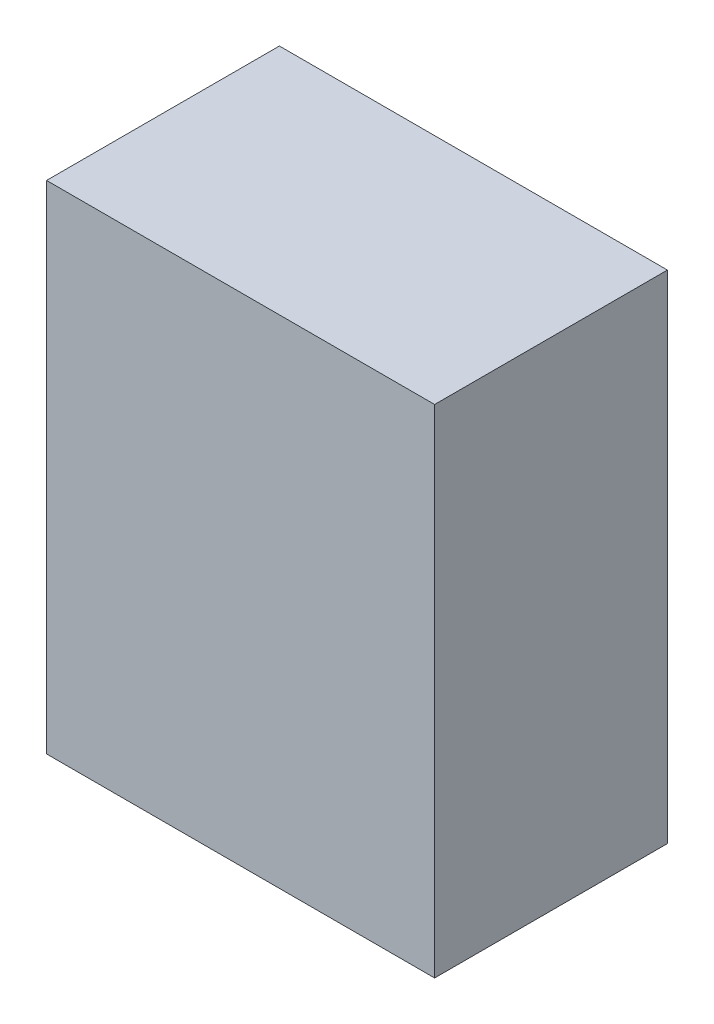
ISO-10303-21;
HEADER;
FILE_DESCRIPTION(('STEP AP214'),'2;1');
FILE_NAME('part.step','',(''),(''),'','','');
FILE_SCHEMA(('AUTOMOTIVE_DESIGN { 1 0 10303 214 1 1 1 1 }'));
ENDSEC;
DATA;
#1=APPLICATION_CONTEXT('core data for automotive mechanical design processes');
#2=APPLICATION_PROTOCOL_DEFINITION('international standard','automotive_design',2000,#1);
#3=PRODUCT_CONTEXT('',#1,'mechanical');
#4=PRODUCT('Part','Part','',(#3));
#5=PRODUCT_RELATED_PRODUCT_CATEGORY('part','',(#4));
#6=PRODUCT_DEFINITION_FORMATION('','',#4);
#7=PRODUCT_DEFINITION_CONTEXT('part definition',#1,'design');
#8=PRODUCT_DEFINITION('design','',#6,#7);
#9=PRODUCT_DEFINITION_SHAPE('','',#8);
#10=(LENGTH_UNIT() NAMED_UNIT(*) SI_UNIT(.MILLI.,.METRE.));
#11=(NAMED_UNIT(*) PLANE_ANGLE_UNIT() SI_UNIT($,.RADIAN.));
#12=(NAMED_UNIT(*) SI_UNIT($,.STERADIAN.) SOLID_ANGLE_UNIT());
#13=UNCERTAINTY_MEASURE_WITH_UNIT(LENGTH_MEASURE(1.E-05),#10,'distance_accuracy_value','');
#14=(GEOMETRIC_REPRESENTATION_CONTEXT(3) GLOBAL_UNCERTAINTY_ASSIGNED_CONTEXT((#13)) GLOBAL_UNIT_ASSIGNED_CONTEXT((#10,
#11,#12)) REPRESENTATION_CONTEXT('',''));
#15=CARTESIAN_POINT('',(0.,0.,0.));
#16=DIRECTION('',(0.,0.,1.));
#17=DIRECTION('',(1.,0.,0.));
#18=AXIS2_PLACEMENT_3D('',#15,#16,#17);
#19=CARTESIAN_POINT('',(0.,0.,0.));
#20=DIRECTION('',(0.,0.,1.));
#21=DIRECTION('',(1.,0.,0.));
#22=AXIS2_PLACEMENT_3D('',#19,#20,#21);
#23=PLANE('',#22);
#24=DIRECTION('',(1.,0.,0.));
#25=VECTOR('',#24,1.);
#26=CARTESIAN_POINT('',(-1.25,-1.6,0.));
#27=LINE('',#26,#25);
#28=CARTESIAN_POINT('',(1.25,-1.6,0.));
#29=VERTEX_POINT('',#28);
#30=CARTESIAN_POINT('',(-1.25,-1.6,0.));
#31=VERTEX_POINT('',#30);
#32=EDGE_CURVE('E81',#29,#31,#27,.F.);
#33=ORIENTED_EDGE('',*,*,#32,.T.);
#34=DIRECTION('',(0.,1.,0.));
#35=VECTOR('',#34,1.);
#36=CARTESIAN_POINT('',(-1.25,1.6,0.));
#37=LINE('',#36,#35);
#38=CARTESIAN_POINT('',(-1.25,1.6,0.));
#39=VERTEX_POINT('',#38);
#40=EDGE_CURVE('E68',#31,#39,#37,.T.);
#41=ORIENTED_EDGE('',*,*,#40,.T.);
#42=DIRECTION('',(1.,0.,0.));
#43=VECTOR('',#42,1.);
#44=CARTESIAN_POINT('',(-1.25,1.6,0.));
#45=LINE('',#44,#43);
#46=CARTESIAN_POINT('',(1.25,1.6,0.));
#47=VERTEX_POINT('',#46);
#48=EDGE_CURVE('E55',#39,#47,#45,.T.);
#49=ORIENTED_EDGE('',*,*,#48,.T.);
#50=DIRECTION('',(0.,-1.,0.));
#51=VECTOR('',#50,1.);
#52=CARTESIAN_POINT('',(1.25,1.6,0.));
#53=LINE('',#52,#51);
#54=EDGE_CURVE('E20',#47,#29,#53,.T.);
#55=ORIENTED_EDGE('',*,*,#54,.T.);
#56=EDGE_LOOP('',(#33,#41,#49,#55));
#57=FACE_BOUND('',#56,.T.);
#58=ADVANCED_FACE('F17',(#57),#23,.F.);
#59=CARTESIAN_POINT('',(1.25,1.6,1.5));
#60=DIRECTION('',(-1.,0.,0.));
#61=DIRECTION('',(0.,-1.,0.));
#62=AXIS2_PLACEMENT_3D('',#59,#60,#61);
#63=PLANE('',#62);
#64=DIRECTION('',(0.,0.,-1.));
#65=VECTOR('',#64,1.);
#66=CARTESIAN_POINT('',(1.25,1.6,1.5));
#67=LINE('',#66,#65);
#68=CARTESIAN_POINT('',(1.25,1.6,1.5));
#69=VERTEX_POINT('',#68);
#70=EDGE_CURVE('E61',#47,#69,#67,.F.);
#71=ORIENTED_EDGE('',*,*,#70,.T.);
#72=DIRECTION('',(0.,1.,0.));
#73=VECTOR('',#72,1.);
#74=CARTESIAN_POINT('',(1.25,0.,1.5));
#75=LINE('',#74,#73);
#76=CARTESIAN_POINT('',(1.25,-1.6,1.5));
#77=VERTEX_POINT('',#76);
#78=EDGE_CURVE('E83',#77,#69,#75,.T.);
#79=ORIENTED_EDGE('',*,*,#78,.F.);
#80=DIRECTION('',(0.,0.,1.));
#81=VECTOR('',#80,1.);
#82=CARTESIAN_POINT('',(1.25,-1.6,1.5));
#83=LINE('',#82,#81);
#84=EDGE_CURVE('E64',#77,#29,#83,.F.);
#85=ORIENTED_EDGE('',*,*,#84,.T.);
#86=ORIENTED_EDGE('',*,*,#54,.F.);
#87=EDGE_LOOP('',(#71,#79,#85,#86));
#88=FACE_BOUND('',#87,.T.);
#89=ADVANCED_FACE('F60',(#88),#63,.F.);
#90=CARTESIAN_POINT('',(-1.25,1.6,1.5));
#91=DIRECTION('',(0.,-1.,0.));
#92=DIRECTION('',(0.,0.,-1.));
#93=AXIS2_PLACEMENT_3D('',#90,#91,#92);
#94=PLANE('',#93);
#95=DIRECTION('',(0.,0.,1.));
#96=VECTOR('',#95,1.);
#97=CARTESIAN_POINT('',(-1.25,1.6,1.5));
#98=LINE('',#97,#96);
#99=CARTESIAN_POINT('',(-1.25,1.6,1.5));
#100=VERTEX_POINT('',#99);
#101=EDGE_CURVE('E70',#39,#100,#98,.T.);
#102=ORIENTED_EDGE('',*,*,#101,.T.);
#103=DIRECTION('',(1.,0.,0.));
#104=VECTOR('',#103,1.);
#105=CARTESIAN_POINT('',(0.,1.6,1.5));
#106=LINE('',#105,#104);
#107=EDGE_CURVE('E74',#69,#100,#106,.F.);
#108=ORIENTED_EDGE('',*,*,#107,.F.);
#109=ORIENTED_EDGE('',*,*,#70,.F.);
#110=ORIENTED_EDGE('',*,*,#48,.F.);
#111=EDGE_LOOP('',(#102,#108,#109,#110));
#112=FACE_BOUND('',#111,.T.);
#113=ADVANCED_FACE('F72',(#112),#94,.F.);
#114=CARTESIAN_POINT('',(-1.25,1.6,1.5));
#115=DIRECTION('',(1.,0.,0.));
#116=DIRECTION('',(0.,1.,0.));
#117=AXIS2_PLACEMENT_3D('',#114,#115,#116);
#118=PLANE('',#117);
#119=DIRECTION('',(0.,0.,1.));
#120=VECTOR('',#119,1.);
#121=CARTESIAN_POINT('',(-1.25,-1.6,1.5));
#122=LINE('',#121,#120);
#123=CARTESIAN_POINT('',(-1.25,-1.6,1.5));
#124=VERTEX_POINT('',#123);
#125=EDGE_CURVE('E35',#31,#124,#122,.T.);
#126=ORIENTED_EDGE('',*,*,#125,.T.);
#127=DIRECTION('',(0.,1.,0.));
#128=VECTOR('',#127,1.);
#129=CARTESIAN_POINT('',(-1.25,0.,1.5));
#130=LINE('',#129,#128);
#131=EDGE_CURVE('E26',#100,#124,#130,.F.);
#132=ORIENTED_EDGE('',*,*,#131,.F.);
#133=ORIENTED_EDGE('',*,*,#101,.F.);
#134=ORIENTED_EDGE('',*,*,#40,.F.);
#135=EDGE_LOOP('',(#126,#132,#133,#134));
#136=FACE_BOUND('',#135,.T.);
#137=ADVANCED_FACE('F89',(#136),#118,.F.);
#138=CARTESIAN_POINT('',(-1.25,-1.6,1.5));
#139=DIRECTION('',(0.,1.,0.));
#140=DIRECTION('',(0.,0.,1.));
#141=AXIS2_PLACEMENT_3D('',#138,#139,#140);
#142=PLANE('',#141);
#143=ORIENTED_EDGE('',*,*,#84,.F.);
#144=DIRECTION('',(1.,0.,0.));
#145=VECTOR('',#144,1.);
#146=CARTESIAN_POINT('',(0.,-1.6,1.5));
#147=LINE('',#146,#145);
#148=EDGE_CURVE('E11',#124,#77,#147,.T.);
#149=ORIENTED_EDGE('',*,*,#148,.F.);
#150=ORIENTED_EDGE('',*,*,#125,.F.);
#151=ORIENTED_EDGE('',*,*,#32,.F.);
#152=EDGE_LOOP('',(#143,#149,#150,#151));
#153=FACE_BOUND('',#152,.T.);
#154=ADVANCED_FACE('F91',(#153),#142,.F.);
#155=CARTESIAN_POINT('',(0.,0.,1.5));
#156=DIRECTION('',(0.,0.,1.));
#157=DIRECTION('',(1.,0.,0.));
#158=AXIS2_PLACEMENT_3D('',#155,#156,#157);
#159=PLANE('',#158);
#160=ORIENTED_EDGE('',*,*,#131,.T.);
#161=ORIENTED_EDGE('',*,*,#148,.T.);
#162=ORIENTED_EDGE('',*,*,#78,.T.);
#163=ORIENTED_EDGE('',*,*,#107,.T.);
#164=EDGE_LOOP('',(#160,#161,#162,#163));
#165=FACE_BOUND('',#164,.T.);
#166=ADVANCED_FACE('F88',(#165),#159,.T.);
#167=CLOSED_SHELL('',(#58,#89,#113,#137,#154,#166));
#168=MANIFOLD_SOLID_BREP('B1',#167);
#169=ADVANCED_BREP_SHAPE_REPRESENTATION('',(#18,#168),#14);
#170=SHAPE_DEFINITION_REPRESENTATION(#9,#169);
ENDSEC;
END-ISO-10303-21;
